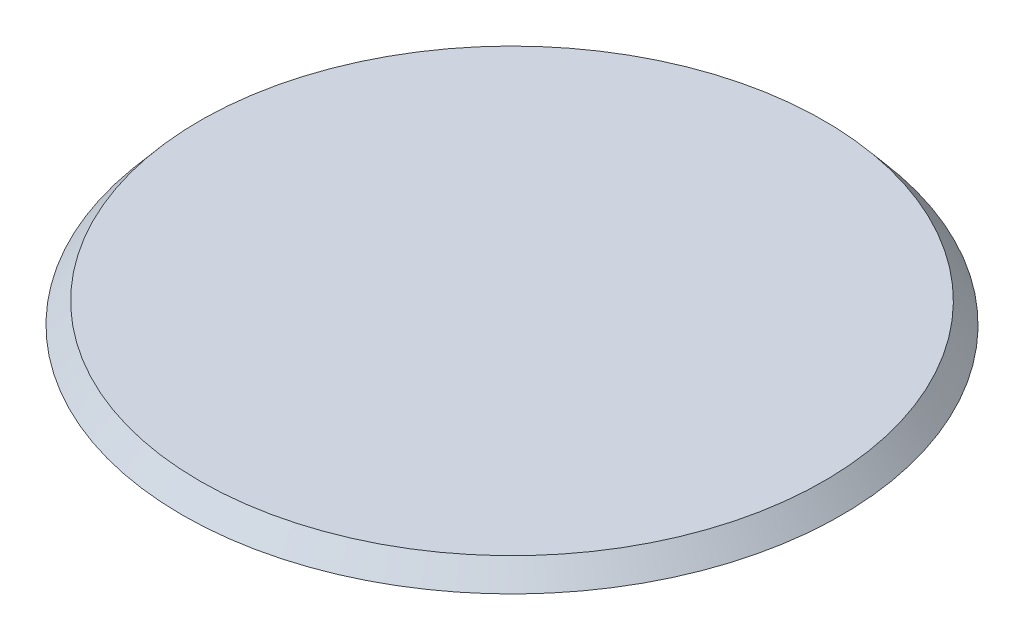
ISO-10303-21;
HEADER;
FILE_DESCRIPTION(('STEP AP214'),'2;1');
FILE_NAME('part.step','',(''),(''),'','','');
FILE_SCHEMA(('AUTOMOTIVE_DESIGN { 1 0 10303 214 1 1 1 1 }'));
ENDSEC;
DATA;
#1=APPLICATION_CONTEXT('core data for automotive mechanical design processes');
#2=APPLICATION_PROTOCOL_DEFINITION('international standard','automotive_design',2000,#1);
#3=PRODUCT_CONTEXT('',#1,'mechanical');
#4=PRODUCT('Part','Part','',(#3));
#5=PRODUCT_RELATED_PRODUCT_CATEGORY('part','',(#4));
#6=PRODUCT_DEFINITION_FORMATION('','',#4);
#7=PRODUCT_DEFINITION_CONTEXT('part definition',#1,'design');
#8=PRODUCT_DEFINITION('design','',#6,#7);
#9=PRODUCT_DEFINITION_SHAPE('','',#8);
#10=(LENGTH_UNIT() NAMED_UNIT(*) SI_UNIT(.MILLI.,.METRE.));
#11=(NAMED_UNIT(*) PLANE_ANGLE_UNIT() SI_UNIT($,.RADIAN.));
#12=(NAMED_UNIT(*) SI_UNIT($,.STERADIAN.) SOLID_ANGLE_UNIT());
#13=UNCERTAINTY_MEASURE_WITH_UNIT(LENGTH_MEASURE(1.E-05),#10,'distance_accuracy_value','');
#14=(GEOMETRIC_REPRESENTATION_CONTEXT(3) GLOBAL_UNCERTAINTY_ASSIGNED_CONTEXT((#13)) GLOBAL_UNIT_ASSIGNED_CONTEXT((#10,
#11,#12)) REPRESENTATION_CONTEXT('',''));
#15=CARTESIAN_POINT('',(0.,0.,0.));
#16=DIRECTION('',(0.,0.,1.));
#17=DIRECTION('',(1.,0.,0.));
#18=AXIS2_PLACEMENT_3D('',#15,#16,#17);
#19=CARTESIAN_POINT('',(0.,0.,0.));
#20=DIRECTION('',(0.,-1.,0.));
#21=DIRECTION('',(0.,0.,1.));
#22=AXIS2_PLACEMENT_3D('',#19,#20,#21);
#23=CONICAL_SURFACE('',#22,30.,0.698131700797732);
#24=CARTESIAN_POINT('',(0.,-2.,0.));
#25=DIRECTION('',(0.,1.,0.));
#26=DIRECTION('',(0.,0.,1.));
#27=AXIS2_PLACEMENT_3D('',#24,#25,#26);
#28=CIRCLE('',#27,31.6781992623546);
#29=CARTESIAN_POINT('',(0.,-2.,31.6781992623546));
#30=VERTEX_POINT('',#29);
#31=EDGE_CURVE('E12',#30,#30,#28,.T.);
#32=ORIENTED_EDGE('',*,*,#31,.T.);
#33=EDGE_LOOP('',(#32));
#34=FACE_BOUND('',#33,.T.);
#35=CARTESIAN_POINT('',(0.,0.,0.));
#36=DIRECTION('',(0.,1.,0.));
#37=DIRECTION('',(0.,0.,1.));
#38=AXIS2_PLACEMENT_3D('',#35,#36,#37);
#39=CIRCLE('',#38,30.);
#40=CARTESIAN_POINT('',(0.,0.,30.));
#41=VERTEX_POINT('',#40);
#42=EDGE_CURVE('E67',#41,#41,#39,.T.);
#43=ORIENTED_EDGE('',*,*,#42,.F.);
#44=EDGE_LOOP('',(#43));
#45=FACE_BOUND('',#44,.T.);
#46=ADVANCED_FACE('F61',(#34,#45),#23,.T.);
#47=CARTESIAN_POINT('',(0.,-2.,0.));
#48=DIRECTION('',(0.,1.,0.));
#49=DIRECTION('',(0.,0.,1.));
#50=AXIS2_PLACEMENT_3D('',#47,#48,#49);
#51=PLANE('',#50);
#52=ORIENTED_EDGE('',*,*,#31,.F.);
#53=EDGE_LOOP('',(#52));
#54=FACE_BOUND('',#53,.T.);
#55=ADVANCED_FACE('F76',(#54),#51,.F.);
#56=CARTESIAN_POINT('',(0.,0.,0.));
#57=DIRECTION('',(0.,1.,0.));
#58=DIRECTION('',(0.,0.,1.));
#59=AXIS2_PLACEMENT_3D('',#56,#57,#58);
#60=PLANE('',#59);
#61=ORIENTED_EDGE('',*,*,#42,.T.);
#62=EDGE_LOOP('',(#61));
#63=FACE_BOUND('',#62,.T.);
#64=ADVANCED_FACE('F73',(#63),#60,.T.);
#65=CLOSED_SHELL('',(#46,#55,#64));
#66=MANIFOLD_SOLID_BREP('B2',#65);
#67=ADVANCED_BREP_SHAPE_REPRESENTATION('',(#18,#66),#14);
#68=SHAPE_DEFINITION_REPRESENTATION(#9,#67);
ENDSEC;
END-ISO-10303-21;
